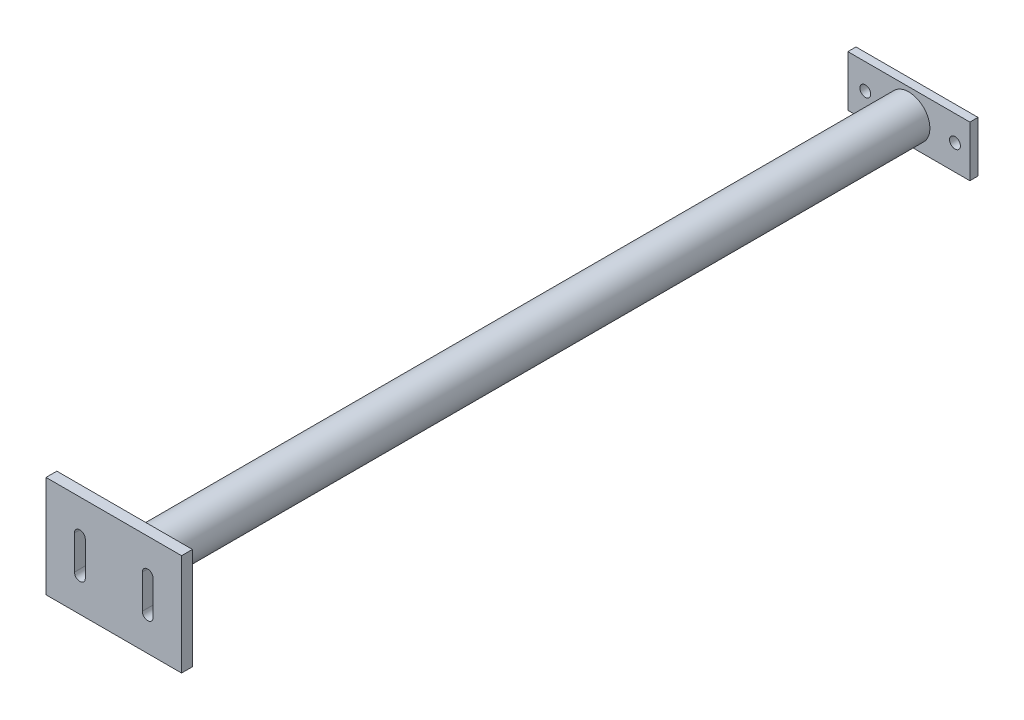
ISO-10303-21;
HEADER;
FILE_DESCRIPTION(('STEP AP214'),'2;1');
FILE_NAME('part.step','',(''),(''),'','','');
FILE_SCHEMA(('AUTOMOTIVE_DESIGN { 1 0 10303 214 1 1 1 1 }'));
ENDSEC;
DATA;
#1=APPLICATION_CONTEXT('core data for automotive mechanical design processes');
#2=APPLICATION_PROTOCOL_DEFINITION('international standard','automotive_design',2000,#1);
#3=PRODUCT_CONTEXT('',#1,'mechanical');
#4=PRODUCT('Part','Part','',(#3));
#5=PRODUCT_RELATED_PRODUCT_CATEGORY('part','',(#4));
#6=PRODUCT_DEFINITION_FORMATION('','',#4);
#7=PRODUCT_DEFINITION_CONTEXT('part definition',#1,'design');
#8=PRODUCT_DEFINITION('design','',#6,#7);
#9=PRODUCT_DEFINITION_SHAPE('','',#8);
#10=(LENGTH_UNIT() NAMED_UNIT(*) SI_UNIT(.MILLI.,.METRE.));
#11=(NAMED_UNIT(*) PLANE_ANGLE_UNIT() SI_UNIT($,.RADIAN.));
#12=(NAMED_UNIT(*) SI_UNIT($,.STERADIAN.) SOLID_ANGLE_UNIT());
#13=UNCERTAINTY_MEASURE_WITH_UNIT(LENGTH_MEASURE(1.E-05),#10,'distance_accuracy_value','');
#14=(GEOMETRIC_REPRESENTATION_CONTEXT(3) GLOBAL_UNCERTAINTY_ASSIGNED_CONTEXT((#13)) GLOBAL_UNIT_ASSIGNED_CONTEXT((#10,
#11,#12)) REPRESENTATION_CONTEXT('',''));
#15=CARTESIAN_POINT('',(0.,0.,0.));
#16=DIRECTION('',(0.,0.,1.));
#17=DIRECTION('',(1.,0.,0.));
#18=AXIS2_PLACEMENT_3D('',#15,#16,#17);
#19=CARTESIAN_POINT('',(0.,0.,1157.));
#20=DIRECTION('',(0.,0.,-1.));
#21=DIRECTION('',(-1.,0.,0.));
#22=AXIS2_PLACEMENT_3D('',#19,#20,#21);
#23=CYLINDRICAL_SURFACE('',#22,31.);
#24=CARTESIAN_POINT('',(0.,0.,1157.));
#25=DIRECTION('',(0.,0.,1.));
#26=DIRECTION('',(1.,0.,0.));
#27=AXIS2_PLACEMENT_3D('',#24,#25,#26);
#28=CIRCLE('',#27,31.);
#29=CARTESIAN_POINT('',(31.,0.,1157.));
#30=VERTEX_POINT('',#29);
#31=EDGE_CURVE('E11',#30,#30,#28,.T.);
#32=ORIENTED_EDGE('',*,*,#31,.F.);
#33=EDGE_LOOP('',(#32));
#34=FACE_BOUND('',#33,.T.);
#35=CARTESIAN_POINT('',(0.,0.,0.));
#36=DIRECTION('',(0.,0.,1.));
#37=DIRECTION('',(1.,0.,0.));
#38=AXIS2_PLACEMENT_3D('',#35,#36,#37);
#39=CIRCLE('',#38,31.);
#40=CARTESIAN_POINT('',(31.,0.,0.));
#41=VERTEX_POINT('',#40);
#42=EDGE_CURVE('E41',#41,#41,#39,.T.);
#43=ORIENTED_EDGE('',*,*,#42,.T.);
#44=EDGE_LOOP('',(#43));
#45=FACE_BOUND('',#44,.T.);
#46=ADVANCED_FACE('F38',(#34,#45),#23,.T.);
#47=CARTESIAN_POINT('',(0.,0.,-12.));
#48=DIRECTION('',(0.,0.,-1.));
#49=DIRECTION('',(-1.,0.,0.));
#50=AXIS2_PLACEMENT_3D('',#47,#48,#49);
#51=PLANE('',#50);
#52=CARTESIAN_POINT('',(-64.2275891692642,0.,-12.));
#53=DIRECTION('',(0.,0.,-1.));
#54=DIRECTION('',(-1.,0.,0.));
#55=AXIS2_PLACEMENT_3D('',#52,#53,#54);
#56=CIRCLE('',#55,8.00000000000001);
#57=CARTESIAN_POINT('',(-72.2275891692642,0.,-12.));
#58=VERTEX_POINT('',#57);
#59=EDGE_CURVE('E274',#58,#58,#56,.T.);
#60=ORIENTED_EDGE('',*,*,#59,.F.);
#61=EDGE_LOOP('',(#60));
#62=FACE_BOUND('',#61,.T.);
#63=DIRECTION('',(0.,-1.,0.));
#64=VECTOR('',#63,1.);
#65=CARTESIAN_POINT('',(90.,37.5,-12.));
#66=LINE('',#65,#64);
#67=CARTESIAN_POINT('',(90.,37.5,-12.));
#68=VERTEX_POINT('',#67);
#69=CARTESIAN_POINT('',(90.,-37.5,-12.));
#70=VERTEX_POINT('',#69);
#71=EDGE_CURVE('E280',#68,#70,#66,.T.);
#72=ORIENTED_EDGE('',*,*,#71,.T.);
#73=DIRECTION('',(-1.,0.,0.));
#74=VECTOR('',#73,1.);
#75=CARTESIAN_POINT('',(90.,-37.5,-12.));
#76=LINE('',#75,#74);
#77=CARTESIAN_POINT('',(-90.,-37.5,-12.));
#78=VERTEX_POINT('',#77);
#79=EDGE_CURVE('E88',#70,#78,#76,.T.);
#80=ORIENTED_EDGE('',*,*,#79,.T.);
#81=DIRECTION('',(0.,1.,0.));
#82=VECTOR('',#81,1.);
#83=CARTESIAN_POINT('',(-90.,37.5,-12.));
#84=LINE('',#83,#82);
#85=CARTESIAN_POINT('',(-90.,37.5,-12.));
#86=VERTEX_POINT('',#85);
#87=EDGE_CURVE('E283',#78,#86,#84,.T.);
#88=ORIENTED_EDGE('',*,*,#87,.T.);
#89=DIRECTION('',(1.,0.,0.));
#90=VECTOR('',#89,1.);
#91=CARTESIAN_POINT('',(90.,37.5,-12.));
#92=LINE('',#91,#90);
#93=EDGE_CURVE('E56',#86,#68,#92,.T.);
#94=ORIENTED_EDGE('',*,*,#93,.T.);
#95=EDGE_LOOP('',(#72,#80,#88,#94));
#96=FACE_BOUND('',#95,.T.);
#97=CARTESIAN_POINT('',(68.0305385279705,0.,-12.));
#98=DIRECTION('',(0.,0.,-1.));
#99=DIRECTION('',(-1.,0.,0.));
#100=AXIS2_PLACEMENT_3D('',#97,#98,#99);
#101=CIRCLE('',#100,8.);
#102=CARTESIAN_POINT('',(60.0305385279705,0.,-12.));
#103=VERTEX_POINT('',#102);
#104=EDGE_CURVE('E267',#103,#103,#101,.T.);
#105=ORIENTED_EDGE('',*,*,#104,.F.);
#106=EDGE_LOOP('',(#105));
#107=FACE_BOUND('',#106,.T.);
#108=ADVANCED_FACE('F313',(#62,#96,#107),#51,.T.);
#109=CARTESIAN_POINT('',(0.,0.,0.));
#110=DIRECTION('',(0.,0.,-1.));
#111=DIRECTION('',(-1.,0.,0.));
#112=AXIS2_PLACEMENT_3D('',#109,#110,#111);
#113=PLANE('',#112);
#114=ORIENTED_EDGE('',*,*,#42,.F.);
#115=EDGE_LOOP('',(#114));
#116=FACE_BOUND('',#115,.T.);
#117=DIRECTION('',(0.,-1.,0.));
#118=VECTOR('',#117,1.);
#119=CARTESIAN_POINT('',(90.,37.5,0.));
#120=LINE('',#119,#118);
#121=CARTESIAN_POINT('',(90.,37.5,0.));
#122=VERTEX_POINT('',#121);
#123=CARTESIAN_POINT('',(90.,-37.5,0.));
#124=VERTEX_POINT('',#123);
#125=EDGE_CURVE('E277',#122,#124,#120,.T.);
#126=ORIENTED_EDGE('',*,*,#125,.F.);
#127=DIRECTION('',(1.,0.,0.));
#128=VECTOR('',#127,1.);
#129=CARTESIAN_POINT('',(90.,37.5,0.));
#130=LINE('',#129,#128);
#131=CARTESIAN_POINT('',(-90.,37.5,0.));
#132=VERTEX_POINT('',#131);
#133=EDGE_CURVE('E80',#132,#122,#130,.T.);
#134=ORIENTED_EDGE('',*,*,#133,.F.);
#135=DIRECTION('',(0.,1.,0.));
#136=VECTOR('',#135,1.);
#137=CARTESIAN_POINT('',(-90.,37.5,0.));
#138=LINE('',#137,#136);
#139=CARTESIAN_POINT('',(-90.,-37.5,0.));
#140=VERTEX_POINT('',#139);
#141=EDGE_CURVE('E74',#140,#132,#138,.T.);
#142=ORIENTED_EDGE('',*,*,#141,.F.);
#143=DIRECTION('',(-1.,0.,0.));
#144=VECTOR('',#143,1.);
#145=CARTESIAN_POINT('',(90.,-37.5,0.));
#146=LINE('',#145,#144);
#147=EDGE_CURVE('E289',#124,#140,#146,.T.);
#148=ORIENTED_EDGE('',*,*,#147,.F.);
#149=EDGE_LOOP('',(#126,#134,#142,#148));
#150=FACE_BOUND('',#149,.T.);
#151=CARTESIAN_POINT('',(-64.2275891692642,0.,0.));
#152=DIRECTION('',(0.,0.,-1.));
#153=DIRECTION('',(-1.,0.,0.));
#154=AXIS2_PLACEMENT_3D('',#151,#152,#153);
#155=CIRCLE('',#154,8.00000000000001);
#156=CARTESIAN_POINT('',(-72.2275891692642,0.,0.));
#157=VERTEX_POINT('',#156);
#158=EDGE_CURVE('E270',#157,#157,#155,.T.);
#159=ORIENTED_EDGE('',*,*,#158,.T.);
#160=EDGE_LOOP('',(#159));
#161=FACE_BOUND('',#160,.T.);
#162=CARTESIAN_POINT('',(68.0305385279705,0.,0.));
#163=DIRECTION('',(0.,0.,-1.));
#164=DIRECTION('',(-1.,0.,0.));
#165=AXIS2_PLACEMENT_3D('',#162,#163,#164);
#166=CIRCLE('',#165,8.);
#167=CARTESIAN_POINT('',(60.0305385279705,0.,0.));
#168=VERTEX_POINT('',#167);
#169=EDGE_CURVE('E271',#168,#168,#166,.T.);
#170=ORIENTED_EDGE('',*,*,#169,.T.);
#171=EDGE_LOOP('',(#170));
#172=FACE_BOUND('',#171,.T.);
#173=ADVANCED_FACE('F309',(#116,#150,#161,#172),#113,.F.);
#174=CARTESIAN_POINT('',(90.,37.5,-12.));
#175=DIRECTION('',(-1.,0.,0.));
#176=DIRECTION('',(0.,-1.,0.));
#177=AXIS2_PLACEMENT_3D('',#174,#175,#176);
#178=PLANE('',#177);
#179=ORIENTED_EDGE('',*,*,#125,.T.);
#180=DIRECTION('',(0.,0.,1.));
#181=VECTOR('',#180,1.);
#182=CARTESIAN_POINT('',(90.,-37.5,-12.));
#183=LINE('',#182,#181);
#184=EDGE_CURVE('E298',#70,#124,#183,.T.);
#185=ORIENTED_EDGE('',*,*,#184,.F.);
#186=ORIENTED_EDGE('',*,*,#71,.F.);
#187=DIRECTION('',(0.,0.,1.));
#188=VECTOR('',#187,1.);
#189=CARTESIAN_POINT('',(90.,37.5,-12.));
#190=LINE('',#189,#188);
#191=EDGE_CURVE('E286',#68,#122,#190,.T.);
#192=ORIENTED_EDGE('',*,*,#191,.T.);
#193=EDGE_LOOP('',(#179,#185,#186,#192));
#194=FACE_BOUND('',#193,.T.);
#195=ADVANCED_FACE('F312',(#194),#178,.F.);
#196=CARTESIAN_POINT('',(90.,-37.5,-12.));
#197=DIRECTION('',(0.,1.,0.));
#198=DIRECTION('',(0.,0.,1.));
#199=AXIS2_PLACEMENT_3D('',#196,#197,#198);
#200=PLANE('',#199);
#201=ORIENTED_EDGE('',*,*,#147,.T.);
#202=DIRECTION('',(0.,0.,1.));
#203=VECTOR('',#202,1.);
#204=CARTESIAN_POINT('',(-90.,-37.5,-12.));
#205=LINE('',#204,#203);
#206=EDGE_CURVE('E296',#78,#140,#205,.T.);
#207=ORIENTED_EDGE('',*,*,#206,.F.);
#208=ORIENTED_EDGE('',*,*,#79,.F.);
#209=ORIENTED_EDGE('',*,*,#184,.T.);
#210=EDGE_LOOP('',(#201,#207,#208,#209));
#211=FACE_BOUND('',#210,.T.);
#212=ADVANCED_FACE('F521',(#211),#200,.F.);
#213=CARTESIAN_POINT('',(-90.,37.5,-12.));
#214=DIRECTION('',(1.,0.,0.));
#215=DIRECTION('',(0.,0.,-1.));
#216=AXIS2_PLACEMENT_3D('',#213,#214,#215);
#217=PLANE('',#216);
#218=ORIENTED_EDGE('',*,*,#141,.T.);
#219=DIRECTION('',(0.,0.,1.));
#220=VECTOR('',#219,1.);
#221=CARTESIAN_POINT('',(-90.,37.5,-12.));
#222=LINE('',#221,#220);
#223=EDGE_CURVE('E294',#86,#132,#222,.T.);
#224=ORIENTED_EDGE('',*,*,#223,.F.);
#225=ORIENTED_EDGE('',*,*,#87,.F.);
#226=ORIENTED_EDGE('',*,*,#206,.T.);
#227=EDGE_LOOP('',(#218,#224,#225,#226));
#228=FACE_BOUND('',#227,.T.);
#229=ADVANCED_FACE('F532',(#228),#217,.F.);
#230=CARTESIAN_POINT('',(90.,37.5,-12.));
#231=DIRECTION('',(0.,-1.,0.));
#232=DIRECTION('',(1.,0.,0.));
#233=AXIS2_PLACEMENT_3D('',#230,#231,#232);
#234=PLANE('',#233);
#235=ORIENTED_EDGE('',*,*,#133,.T.);
#236=ORIENTED_EDGE('',*,*,#191,.F.);
#237=ORIENTED_EDGE('',*,*,#93,.F.);
#238=ORIENTED_EDGE('',*,*,#223,.T.);
#239=EDGE_LOOP('',(#235,#236,#237,#238));
#240=FACE_BOUND('',#239,.T.);
#241=ADVANCED_FACE('F334',(#240),#234,.F.);
#242=CARTESIAN_POINT('',(-64.2275891692642,0.,-12.));
#243=DIRECTION('',(0.,0.,1.));
#244=DIRECTION('',(1.,0.,0.));
#245=AXIS2_PLACEMENT_3D('',#242,#243,#244);
#246=CYLINDRICAL_SURFACE('',#245,8.00000000000001);
#247=ORIENTED_EDGE('',*,*,#59,.T.);
#248=EDGE_LOOP('',(#247));
#249=FACE_BOUND('',#248,.T.);
#250=ORIENTED_EDGE('',*,*,#158,.F.);
#251=EDGE_LOOP('',(#250));
#252=FACE_BOUND('',#251,.T.);
#253=ADVANCED_FACE('F324',(#249,#252),#246,.F.);
#254=CARTESIAN_POINT('',(68.0305385279705,0.,-12.));
#255=DIRECTION('',(0.,0.,1.));
#256=DIRECTION('',(1.,0.,0.));
#257=AXIS2_PLACEMENT_3D('',#254,#255,#256);
#258=CYLINDRICAL_SURFACE('',#257,8.);
#259=ORIENTED_EDGE('',*,*,#104,.T.);
#260=EDGE_LOOP('',(#259));
#261=FACE_BOUND('',#260,.T.);
#262=ORIENTED_EDGE('',*,*,#169,.F.);
#263=EDGE_LOOP('',(#262));
#264=FACE_BOUND('',#263,.T.);
#265=ADVANCED_FACE('F322',(#261,#264),#258,.F.);
#266=CARTESIAN_POINT('',(0.,0.,1173.));
#267=DIRECTION('',(0.,0.,1.));
#268=DIRECTION('',(1.,0.,0.));
#269=AXIS2_PLACEMENT_3D('',#266,#267,#268);
#270=PLANE('',#269);
#271=DIRECTION('',(0.,-1.,0.));
#272=VECTOR('',#271,1.);
#273=CARTESIAN_POINT('',(-100.,75.,1173.));
#274=LINE('',#273,#272);
#275=CARTESIAN_POINT('',(-100.,75.,1173.));
#276=VERTEX_POINT('',#275);
#277=CARTESIAN_POINT('',(-100.,-75.,1173.));
#278=VERTEX_POINT('',#277);
#279=EDGE_CURVE('E237',#276,#278,#274,.T.);
#280=ORIENTED_EDGE('',*,*,#279,.T.);
#281=DIRECTION('',(1.,0.,0.));
#282=VECTOR('',#281,1.);
#283=CARTESIAN_POINT('',(-100.,-75.,1173.));
#284=LINE('',#283,#282);
#285=CARTESIAN_POINT('',(100.,-75.,1173.));
#286=VERTEX_POINT('',#285);
#287=EDGE_CURVE('E240',#278,#286,#284,.T.);
#288=ORIENTED_EDGE('',*,*,#287,.T.);
#289=DIRECTION('',(0.,1.,0.));
#290=VECTOR('',#289,1.);
#291=CARTESIAN_POINT('',(100.,75.,1173.));
#292=LINE('',#291,#290);
#293=CARTESIAN_POINT('',(100.,75.,1173.));
#294=VERTEX_POINT('',#293);
#295=EDGE_CURVE('E243',#286,#294,#292,.T.);
#296=ORIENTED_EDGE('',*,*,#295,.T.);
#297=DIRECTION('',(-1.,0.,0.));
#298=VECTOR('',#297,1.);
#299=CARTESIAN_POINT('',(-100.,75.,1173.));
#300=LINE('',#299,#298);
#301=EDGE_CURVE('E245',#294,#276,#300,.T.);
#302=ORIENTED_EDGE('',*,*,#301,.T.);
#303=EDGE_LOOP('',(#280,#288,#296,#302));
#304=FACE_BOUND('',#303,.T.);
#305=DIRECTION('',(0.,-1.,0.));
#306=VECTOR('',#305,1.);
#307=CARTESIAN_POINT('',(-58.,25.,1173.));
#308=LINE('',#307,#306);
#309=CARTESIAN_POINT('',(-58.,25.,1173.));
#310=VERTEX_POINT('',#309);
#311=CARTESIAN_POINT('',(-58.,-25.,1173.));
#312=VERTEX_POINT('',#311);
#313=EDGE_CURVE('E208',#310,#312,#308,.T.);
#314=ORIENTED_EDGE('',*,*,#313,.F.);
#315=CARTESIAN_POINT('',(-50.,25.,1173.));
#316=DIRECTION('',(0.,0.,1.));
#317=DIRECTION('',(1.,0.,0.));
#318=AXIS2_PLACEMENT_3D('',#315,#316,#317);
#319=CIRCLE('',#318,8.);
#320=CARTESIAN_POINT('',(-42.,25.,1173.));
#321=VERTEX_POINT('',#320);
#322=EDGE_CURVE('E206',#321,#310,#319,.T.);
#323=ORIENTED_EDGE('',*,*,#322,.F.);
#324=DIRECTION('',(0.,1.,0.));
#325=VECTOR('',#324,1.);
#326=CARTESIAN_POINT('',(-42.,25.,1173.));
#327=LINE('',#326,#325);
#328=CARTESIAN_POINT('',(-42.,-25.,1173.));
#329=VERTEX_POINT('',#328);
#330=EDGE_CURVE('E214',#329,#321,#327,.T.);
#331=ORIENTED_EDGE('',*,*,#330,.F.);
#332=CARTESIAN_POINT('',(-50.,-25.,1173.));
#333=DIRECTION('',(0.,0.,1.));
#334=DIRECTION('',(1.,0.,0.));
#335=AXIS2_PLACEMENT_3D('',#332,#333,#334);
#336=CIRCLE('',#335,8.);
#337=EDGE_CURVE('E211',#312,#329,#336,.T.);
#338=ORIENTED_EDGE('',*,*,#337,.F.);
#339=EDGE_LOOP('',(#314,#323,#331,#338));
#340=FACE_BOUND('',#339,.T.);
#341=DIRECTION('',(0.,-1.,0.));
#342=VECTOR('',#341,1.);
#343=CARTESIAN_POINT('',(42.,25.,1173.));
#344=LINE('',#343,#342);
#345=CARTESIAN_POINT('',(42.,25.,1173.));
#346=VERTEX_POINT('',#345);
#347=CARTESIAN_POINT('',(42.,-25.,1173.));
#348=VERTEX_POINT('',#347);
#349=EDGE_CURVE('E174',#346,#348,#344,.T.);
#350=ORIENTED_EDGE('',*,*,#349,.F.);
#351=CARTESIAN_POINT('',(50.,25.,1173.));
#352=DIRECTION('',(0.,0.,1.));
#353=DIRECTION('',(-1.,0.,0.));
#354=AXIS2_PLACEMENT_3D('',#351,#352,#353);
#355=CIRCLE('',#354,8.);
#356=CARTESIAN_POINT('',(58.,25.,1173.));
#357=VERTEX_POINT('',#356);
#358=EDGE_CURVE('E164',#357,#346,#355,.T.);
#359=ORIENTED_EDGE('',*,*,#358,.F.);
#360=DIRECTION('',(0.,1.,0.));
#361=VECTOR('',#360,1.);
#362=CARTESIAN_POINT('',(58.,25.,1173.));
#363=LINE('',#362,#361);
#364=CARTESIAN_POINT('',(58.,-25.,1173.));
#365=VERTEX_POINT('',#364);
#366=EDGE_CURVE('E190',#365,#357,#363,.T.);
#367=ORIENTED_EDGE('',*,*,#366,.F.);
#368=CARTESIAN_POINT('',(50.,-25.,1173.));
#369=DIRECTION('',(0.,0.,1.));
#370=DIRECTION('',(-1.,0.,0.));
#371=AXIS2_PLACEMENT_3D('',#368,#369,#370);
#372=CIRCLE('',#371,8.);
#373=EDGE_CURVE('E188',#348,#365,#372,.T.);
#374=ORIENTED_EDGE('',*,*,#373,.F.);
#375=EDGE_LOOP('',(#350,#359,#367,#374));
#376=FACE_BOUND('',#375,.T.);
#377=ADVANCED_FACE('F186',(#304,#340,#376),#270,.T.);
#378=CARTESIAN_POINT('',(0.,0.,1157.));
#379=DIRECTION('',(0.,0.,1.));
#380=DIRECTION('',(1.,0.,0.));
#381=AXIS2_PLACEMENT_3D('',#378,#379,#380);
#382=PLANE('',#381);
#383=ORIENTED_EDGE('',*,*,#31,.T.);
#384=EDGE_LOOP('',(#383));
#385=FACE_BOUND('',#384,.T.);
#386=CARTESIAN_POINT('',(-50.,25.,1157.));
#387=DIRECTION('',(0.,0.,1.));
#388=DIRECTION('',(1.,0.,0.));
#389=AXIS2_PLACEMENT_3D('',#386,#387,#388);
#390=CIRCLE('',#389,8.);
#391=CARTESIAN_POINT('',(-42.,25.,1157.));
#392=VERTEX_POINT('',#391);
#393=CARTESIAN_POINT('',(-58.,25.,1157.));
#394=VERTEX_POINT('',#393);
#395=EDGE_CURVE('E182',#392,#394,#390,.T.);
#396=ORIENTED_EDGE('',*,*,#395,.T.);
#397=DIRECTION('',(0.,-1.,0.));
#398=VECTOR('',#397,1.);
#399=CARTESIAN_POINT('',(-58.,25.,1157.));
#400=LINE('',#399,#398);
#401=CARTESIAN_POINT('',(-58.,-25.,1157.));
#402=VERTEX_POINT('',#401);
#403=EDGE_CURVE('E219',#394,#402,#400,.T.);
#404=ORIENTED_EDGE('',*,*,#403,.T.);
#405=CARTESIAN_POINT('',(-50.,-25.,1157.));
#406=DIRECTION('',(0.,0.,1.));
#407=DIRECTION('',(1.,0.,0.));
#408=AXIS2_PLACEMENT_3D('',#405,#406,#407);
#409=CIRCLE('',#408,8.);
#410=CARTESIAN_POINT('',(-42.,-25.,1157.));
#411=VERTEX_POINT('',#410);
#412=EDGE_CURVE('E222',#402,#411,#409,.T.);
#413=ORIENTED_EDGE('',*,*,#412,.T.);
#414=DIRECTION('',(0.,1.,0.));
#415=VECTOR('',#414,1.);
#416=CARTESIAN_POINT('',(-42.,25.,1157.));
#417=LINE('',#416,#415);
#418=EDGE_CURVE('E209',#411,#392,#417,.T.);
#419=ORIENTED_EDGE('',*,*,#418,.T.);
#420=EDGE_LOOP('',(#396,#404,#413,#419));
#421=FACE_BOUND('',#420,.T.);
#422=DIRECTION('',(0.,-1.,0.));
#423=VECTOR('',#422,1.);
#424=CARTESIAN_POINT('',(-100.,75.,1157.));
#425=LINE('',#424,#423);
#426=CARTESIAN_POINT('',(-100.,75.,1157.));
#427=VERTEX_POINT('',#426);
#428=CARTESIAN_POINT('',(-100.,-75.,1157.));
#429=VERTEX_POINT('',#428);
#430=EDGE_CURVE('E236',#427,#429,#425,.T.);
#431=ORIENTED_EDGE('',*,*,#430,.F.);
#432=DIRECTION('',(-1.,0.,0.));
#433=VECTOR('',#432,1.);
#434=CARTESIAN_POINT('',(-100.,75.,1157.));
#435=LINE('',#434,#433);
#436=CARTESIAN_POINT('',(100.,75.,1157.));
#437=VERTEX_POINT('',#436);
#438=EDGE_CURVE('E241',#437,#427,#435,.T.);
#439=ORIENTED_EDGE('',*,*,#438,.F.);
#440=DIRECTION('',(0.,1.,0.));
#441=VECTOR('',#440,1.);
#442=CARTESIAN_POINT('',(100.,75.,1157.));
#443=LINE('',#442,#441);
#444=CARTESIAN_POINT('',(100.,-75.,1157.));
#445=VERTEX_POINT('',#444);
#446=EDGE_CURVE('E252',#445,#437,#443,.T.);
#447=ORIENTED_EDGE('',*,*,#446,.F.);
#448=DIRECTION('',(1.,0.,0.));
#449=VECTOR('',#448,1.);
#450=CARTESIAN_POINT('',(-100.,-75.,1157.));
#451=LINE('',#450,#449);
#452=EDGE_CURVE('E250',#429,#445,#451,.T.);
#453=ORIENTED_EDGE('',*,*,#452,.F.);
#454=EDGE_LOOP('',(#431,#439,#447,#453));
#455=FACE_BOUND('',#454,.T.);
#456=CARTESIAN_POINT('',(50.,25.,1157.));
#457=DIRECTION('',(0.,0.,1.));
#458=DIRECTION('',(-1.,0.,0.));
#459=AXIS2_PLACEMENT_3D('',#456,#457,#458);
#460=CIRCLE('',#459,8.);
#461=CARTESIAN_POINT('',(58.,25.,1157.));
#462=VERTEX_POINT('',#461);
#463=CARTESIAN_POINT('',(42.,25.,1157.));
#464=VERTEX_POINT('',#463);
#465=EDGE_CURVE('E194',#462,#464,#460,.T.);
#466=ORIENTED_EDGE('',*,*,#465,.T.);
#467=DIRECTION('',(0.,-1.,0.));
#468=VECTOR('',#467,1.);
#469=CARTESIAN_POINT('',(42.,25.,1157.));
#470=LINE('',#469,#468);
#471=CARTESIAN_POINT('',(42.,-25.,1157.));
#472=VERTEX_POINT('',#471);
#473=EDGE_CURVE('E181',#464,#472,#470,.T.);
#474=ORIENTED_EDGE('',*,*,#473,.T.);
#475=CARTESIAN_POINT('',(50.,-25.,1157.));
#476=DIRECTION('',(0.,0.,1.));
#477=DIRECTION('',(-1.,0.,0.));
#478=AXIS2_PLACEMENT_3D('',#475,#476,#477);
#479=CIRCLE('',#478,8.);
#480=CARTESIAN_POINT('',(58.,-25.,1157.));
#481=VERTEX_POINT('',#480);
#482=EDGE_CURVE('E197',#472,#481,#479,.T.);
#483=ORIENTED_EDGE('',*,*,#482,.T.);
#484=DIRECTION('',(0.,1.,0.));
#485=VECTOR('',#484,1.);
#486=CARTESIAN_POINT('',(58.,25.,1157.));
#487=LINE('',#486,#485);
#488=EDGE_CURVE('E175',#481,#462,#487,.T.);
#489=ORIENTED_EDGE('',*,*,#488,.T.);
#490=EDGE_LOOP('',(#466,#474,#483,#489));
#491=FACE_BOUND('',#490,.T.);
#492=ADVANCED_FACE('F331',(#385,#421,#455,#491),#382,.F.);
#493=CARTESIAN_POINT('',(-100.,75.,1173.));
#494=DIRECTION('',(1.,0.,0.));
#495=DIRECTION('',(0.,1.,0.));
#496=AXIS2_PLACEMENT_3D('',#493,#494,#495);
#497=PLANE('',#496);
#498=ORIENTED_EDGE('',*,*,#430,.T.);
#499=DIRECTION('',(0.,0.,-1.));
#500=VECTOR('',#499,1.);
#501=CARTESIAN_POINT('',(-100.,-75.,1173.));
#502=LINE('',#501,#500);
#503=EDGE_CURVE('E263',#278,#429,#502,.T.);
#504=ORIENTED_EDGE('',*,*,#503,.F.);
#505=ORIENTED_EDGE('',*,*,#279,.F.);
#506=DIRECTION('',(0.,0.,-1.));
#507=VECTOR('',#506,1.);
#508=CARTESIAN_POINT('',(-100.,75.,1173.));
#509=LINE('',#508,#507);
#510=EDGE_CURVE('E247',#276,#427,#509,.T.);
#511=ORIENTED_EDGE('',*,*,#510,.T.);
#512=EDGE_LOOP('',(#498,#504,#505,#511));
#513=FACE_BOUND('',#512,.T.);
#514=ADVANCED_FACE('F349',(#513),#497,.F.);
#515=CARTESIAN_POINT('',(-100.,-75.,1173.));
#516=DIRECTION('',(0.,1.,0.));
#517=DIRECTION('',(0.,0.,1.));
#518=AXIS2_PLACEMENT_3D('',#515,#516,#517);
#519=PLANE('',#518);
#520=ORIENTED_EDGE('',*,*,#452,.T.);
#521=DIRECTION('',(0.,0.,-1.));
#522=VECTOR('',#521,1.);
#523=CARTESIAN_POINT('',(100.,-75.,1173.));
#524=LINE('',#523,#522);
#525=EDGE_CURVE('E260',#286,#445,#524,.T.);
#526=ORIENTED_EDGE('',*,*,#525,.F.);
#527=ORIENTED_EDGE('',*,*,#287,.F.);
#528=ORIENTED_EDGE('',*,*,#503,.T.);
#529=EDGE_LOOP('',(#520,#526,#527,#528));
#530=FACE_BOUND('',#529,.T.);
#531=ADVANCED_FACE('F396',(#530),#519,.F.);
#532=CARTESIAN_POINT('',(100.,75.,1173.));
#533=DIRECTION('',(-1.,0.,0.));
#534=DIRECTION('',(0.,-1.,0.));
#535=AXIS2_PLACEMENT_3D('',#532,#533,#534);
#536=PLANE('',#535);
#537=ORIENTED_EDGE('',*,*,#446,.T.);
#538=DIRECTION('',(0.,0.,-1.));
#539=VECTOR('',#538,1.);
#540=CARTESIAN_POINT('',(100.,75.,1173.));
#541=LINE('',#540,#539);
#542=EDGE_CURVE('E257',#294,#437,#541,.T.);
#543=ORIENTED_EDGE('',*,*,#542,.F.);
#544=ORIENTED_EDGE('',*,*,#295,.F.);
#545=ORIENTED_EDGE('',*,*,#525,.T.);
#546=EDGE_LOOP('',(#537,#543,#544,#545));
#547=FACE_BOUND('',#546,.T.);
#548=ADVANCED_FACE('F392',(#547),#536,.F.);
#549=CARTESIAN_POINT('',(-100.,75.,1173.));
#550=DIRECTION('',(0.,-1.,0.));
#551=DIRECTION('',(1.,0.,0.));
#552=AXIS2_PLACEMENT_3D('',#549,#550,#551);
#553=PLANE('',#552);
#554=ORIENTED_EDGE('',*,*,#438,.T.);
#555=ORIENTED_EDGE('',*,*,#510,.F.);
#556=ORIENTED_EDGE('',*,*,#301,.F.);
#557=ORIENTED_EDGE('',*,*,#542,.T.);
#558=EDGE_LOOP('',(#554,#555,#556,#557));
#559=FACE_BOUND('',#558,.T.);
#560=ADVANCED_FACE('F387',(#559),#553,.F.);
#561=CARTESIAN_POINT('',(-50.,25.,1173.));
#562=DIRECTION('',(0.,0.,-1.));
#563=DIRECTION('',(-1.,0.,0.));
#564=AXIS2_PLACEMENT_3D('',#561,#562,#563);
#565=CYLINDRICAL_SURFACE('',#564,8.);
#566=ORIENTED_EDGE('',*,*,#395,.F.);
#567=DIRECTION('',(0.,0.,-1.));
#568=VECTOR('',#567,1.);
#569=CARTESIAN_POINT('',(-42.,25.,1173.));
#570=LINE('',#569,#568);
#571=EDGE_CURVE('E216',#321,#392,#570,.T.);
#572=ORIENTED_EDGE('',*,*,#571,.F.);
#573=ORIENTED_EDGE('',*,*,#322,.T.);
#574=DIRECTION('',(0.,0.,-1.));
#575=VECTOR('',#574,1.);
#576=CARTESIAN_POINT('',(-58.,25.,1173.));
#577=LINE('',#576,#575);
#578=EDGE_CURVE('E233',#310,#394,#577,.T.);
#579=ORIENTED_EDGE('',*,*,#578,.T.);
#580=EDGE_LOOP('',(#566,#572,#573,#579));
#581=FACE_BOUND('',#580,.T.);
#582=ADVANCED_FACE('F384',(#581),#565,.F.);
#583=CARTESIAN_POINT('',(-58.,25.,1173.));
#584=DIRECTION('',(1.,0.,0.));
#585=DIRECTION('',(0.,0.,-1.));
#586=AXIS2_PLACEMENT_3D('',#583,#584,#585);
#587=PLANE('',#586);
#588=ORIENTED_EDGE('',*,*,#403,.F.);
#589=ORIENTED_EDGE('',*,*,#578,.F.);
#590=ORIENTED_EDGE('',*,*,#313,.T.);
#591=DIRECTION('',(0.,0.,-1.));
#592=VECTOR('',#591,1.);
#593=CARTESIAN_POINT('',(-58.,-25.,1173.));
#594=LINE('',#593,#592);
#595=EDGE_CURVE('E231',#312,#402,#594,.T.);
#596=ORIENTED_EDGE('',*,*,#595,.T.);
#597=EDGE_LOOP('',(#588,#589,#590,#596));
#598=FACE_BOUND('',#597,.T.);
#599=ADVANCED_FACE('F380',(#598),#587,.T.);
#600=CARTESIAN_POINT('',(-50.,-25.,1173.));
#601=DIRECTION('',(0.,0.,-1.));
#602=DIRECTION('',(-1.,0.,0.));
#603=AXIS2_PLACEMENT_3D('',#600,#601,#602);
#604=CYLINDRICAL_SURFACE('',#603,8.);
#605=ORIENTED_EDGE('',*,*,#412,.F.);
#606=ORIENTED_EDGE('',*,*,#595,.F.);
#607=ORIENTED_EDGE('',*,*,#337,.T.);
#608=DIRECTION('',(0.,0.,-1.));
#609=VECTOR('',#608,1.);
#610=CARTESIAN_POINT('',(-42.,-25.,1173.));
#611=LINE('',#610,#609);
#612=EDGE_CURVE('E229',#329,#411,#611,.T.);
#613=ORIENTED_EDGE('',*,*,#612,.T.);
#614=EDGE_LOOP('',(#605,#606,#607,#613));
#615=FACE_BOUND('',#614,.T.);
#616=ADVANCED_FACE('F376',(#615),#604,.F.);
#617=CARTESIAN_POINT('',(-42.,25.,1173.));
#618=DIRECTION('',(-1.,0.,0.));
#619=DIRECTION('',(0.,0.,1.));
#620=AXIS2_PLACEMENT_3D('',#617,#618,#619);
#621=PLANE('',#620);
#622=ORIENTED_EDGE('',*,*,#418,.F.);
#623=ORIENTED_EDGE('',*,*,#612,.F.);
#624=ORIENTED_EDGE('',*,*,#330,.T.);
#625=ORIENTED_EDGE('',*,*,#571,.T.);
#626=EDGE_LOOP('',(#622,#623,#624,#625));
#627=FACE_BOUND('',#626,.T.);
#628=ADVANCED_FACE('F373',(#627),#621,.T.);
#629=CARTESIAN_POINT('',(50.,25.,1173.));
#630=DIRECTION('',(0.,0.,-1.));
#631=DIRECTION('',(-1.,0.,0.));
#632=AXIS2_PLACEMENT_3D('',#629,#630,#631);
#633=CYLINDRICAL_SURFACE('',#632,8.);
#634=ORIENTED_EDGE('',*,*,#465,.F.);
#635=DIRECTION('',(0.,0.,-1.));
#636=VECTOR('',#635,1.);
#637=CARTESIAN_POINT('',(58.,25.,1173.));
#638=LINE('',#637,#636);
#639=EDGE_CURVE('E170',#357,#462,#638,.T.);
#640=ORIENTED_EDGE('',*,*,#639,.F.);
#641=ORIENTED_EDGE('',*,*,#358,.T.);
#642=DIRECTION('',(0.,0.,-1.));
#643=VECTOR('',#642,1.);
#644=CARTESIAN_POINT('',(42.,25.,1173.));
#645=LINE('',#644,#643);
#646=EDGE_CURVE('E167',#346,#464,#645,.T.);
#647=ORIENTED_EDGE('',*,*,#646,.T.);
#648=EDGE_LOOP('',(#634,#640,#641,#647));
#649=FACE_BOUND('',#648,.T.);
#650=ADVANCED_FACE('F166',(#649),#633,.F.);
#651=CARTESIAN_POINT('',(42.,25.,1173.));
#652=DIRECTION('',(1.,0.,0.));
#653=DIRECTION('',(0.,0.,-1.));
#654=AXIS2_PLACEMENT_3D('',#651,#652,#653);
#655=PLANE('',#654);
#656=ORIENTED_EDGE('',*,*,#473,.F.);
#657=ORIENTED_EDGE('',*,*,#646,.F.);
#658=ORIENTED_EDGE('',*,*,#349,.T.);
#659=DIRECTION('',(0.,0.,-1.));
#660=VECTOR('',#659,1.);
#661=CARTESIAN_POINT('',(42.,-25.,1173.));
#662=LINE('',#661,#660);
#663=EDGE_CURVE('E183',#348,#472,#662,.T.);
#664=ORIENTED_EDGE('',*,*,#663,.T.);
#665=EDGE_LOOP('',(#656,#657,#658,#664));
#666=FACE_BOUND('',#665,.T.);
#667=ADVANCED_FACE('F178',(#666),#655,.T.);
#668=CARTESIAN_POINT('',(50.,-25.,1173.));
#669=DIRECTION('',(0.,0.,-1.));
#670=DIRECTION('',(-1.,0.,0.));
#671=AXIS2_PLACEMENT_3D('',#668,#669,#670);
#672=CYLINDRICAL_SURFACE('',#671,8.);
#673=ORIENTED_EDGE('',*,*,#482,.F.);
#674=ORIENTED_EDGE('',*,*,#663,.F.);
#675=ORIENTED_EDGE('',*,*,#373,.T.);
#676=DIRECTION('',(0.,0.,-1.));
#677=VECTOR('',#676,1.);
#678=CARTESIAN_POINT('',(58.,-25.,1173.));
#679=LINE('',#678,#677);
#680=EDGE_CURVE('E203',#365,#481,#679,.T.);
#681=ORIENTED_EDGE('',*,*,#680,.T.);
#682=EDGE_LOOP('',(#673,#674,#675,#681));
#683=FACE_BOUND('',#682,.T.);
#684=ADVANCED_FACE('F361',(#683),#672,.F.);
#685=CARTESIAN_POINT('',(58.,25.,1173.));
#686=DIRECTION('',(-1.,0.,0.));
#687=DIRECTION('',(0.,0.,1.));
#688=AXIS2_PLACEMENT_3D('',#685,#686,#687);
#689=PLANE('',#688);
#690=ORIENTED_EDGE('',*,*,#488,.F.);
#691=ORIENTED_EDGE('',*,*,#680,.F.);
#692=ORIENTED_EDGE('',*,*,#366,.T.);
#693=ORIENTED_EDGE('',*,*,#639,.T.);
#694=EDGE_LOOP('',(#690,#691,#692,#693));
#695=FACE_BOUND('',#694,.T.);
#696=ADVANCED_FACE('F358',(#695),#689,.T.);
#697=CLOSED_SHELL('',(#46,#108,#173,#195,#212,#229,#241,#253,#265,#377,#492,#514,#531,#548,#560,
#582,#599,#616,#628,#650,#667,#684,#696));
#698=CARTESIAN_POINT('',(0.,0.,0.));
#699=DIRECTION('',(0.,0.,1.));
#700=DIRECTION('',(1.,0.,0.));
#701=AXIS2_PLACEMENT_3D('',#698,#699,#700);
#702=CIRCLE('',#701,25.);
#703=CARTESIAN_POINT('',(25.,0.,0.));
#704=VERTEX_POINT('',#703);
#705=EDGE_CURVE('E48',#704,#704,#702,.T.);
#706=ORIENTED_EDGE('',*,*,#705,.T.);
#707=EDGE_LOOP('',(#706));
#708=FACE_BOUND('',#707,.T.);
#709=ADVANCED_FACE('F315',(#708),#113,.F.);
#710=CARTESIAN_POINT('',(0.,0.,1157.));
#711=DIRECTION('',(0.,0.,-1.));
#712=DIRECTION('',(-1.,0.,0.));
#713=AXIS2_PLACEMENT_3D('',#710,#711,#712);
#714=CYLINDRICAL_SURFACE('',#713,25.);
#715=CARTESIAN_POINT('',(0.,0.,1157.));
#716=DIRECTION('',(0.,0.,1.));
#717=DIRECTION('',(1.,0.,0.));
#718=AXIS2_PLACEMENT_3D('',#715,#716,#717);
#719=CIRCLE('',#718,25.);
#720=CARTESIAN_POINT('',(25.,0.,1157.));
#721=VERTEX_POINT('',#720);
#722=EDGE_CURVE('E266',#721,#721,#719,.T.);
#723=ORIENTED_EDGE('',*,*,#722,.T.);
#724=EDGE_LOOP('',(#723));
#725=FACE_BOUND('',#724,.T.);
#726=ORIENTED_EDGE('',*,*,#705,.F.);
#727=EDGE_LOOP('',(#726));
#728=FACE_BOUND('',#727,.T.);
#729=ADVANCED_FACE('F482',(#725,#728),#714,.F.);
#730=ORIENTED_EDGE('',*,*,#722,.F.);
#731=EDGE_LOOP('',(#730));
#732=FACE_BOUND('',#731,.T.);
#733=ADVANCED_FACE('F351',(#732),#382,.F.);
#734=CLOSED_SHELL('',(#709,#729,#733));
#735=ORIENTED_CLOSED_SHELL('',*,#734,.T.);
#736=BREP_WITH_VOIDS('B2',#697,(#735));
#737=ADVANCED_BREP_SHAPE_REPRESENTATION('',(#18,#736),#14);
#738=SHAPE_DEFINITION_REPRESENTATION(#9,#737);
ENDSEC;
END-ISO-10303-21;
